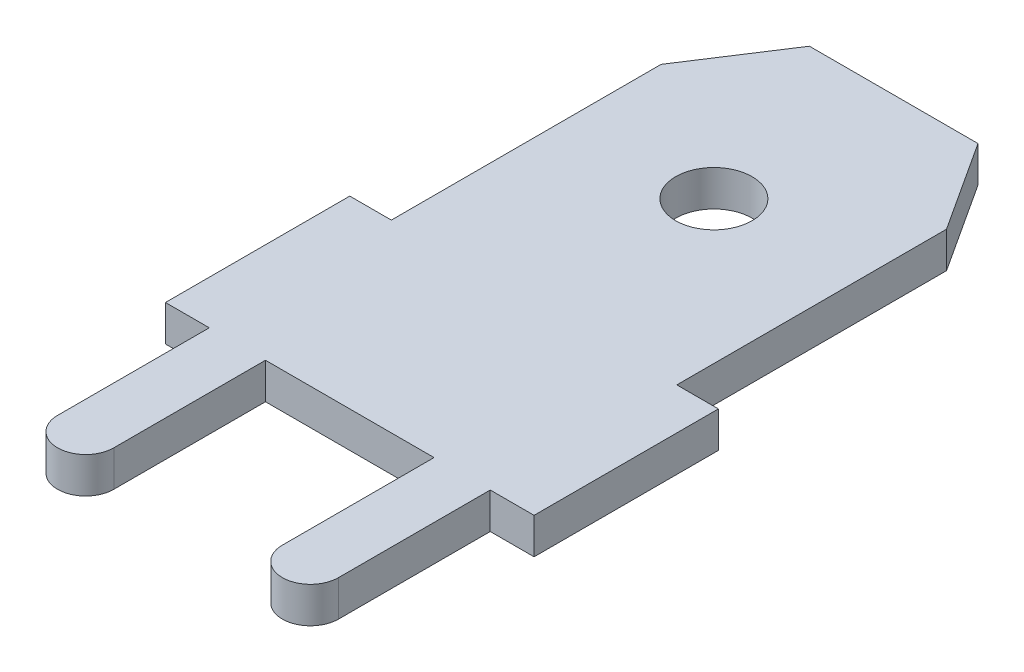
ISO-10303-21;
HEADER;
FILE_DESCRIPTION(('STEP AP214'),'2;1');
FILE_NAME('part.step','',(''),(''),'','','');
FILE_SCHEMA(('AUTOMOTIVE_DESIGN { 1 0 10303 214 1 1 1 1 }'));
ENDSEC;
DATA;
#1=APPLICATION_CONTEXT('core data for automotive mechanical design processes');
#2=APPLICATION_PROTOCOL_DEFINITION('international standard','automotive_design',2000,#1);
#3=PRODUCT_CONTEXT('',#1,'mechanical');
#4=PRODUCT('Part','Part','',(#3));
#5=PRODUCT_RELATED_PRODUCT_CATEGORY('part','',(#4));
#6=PRODUCT_DEFINITION_FORMATION('','',#4);
#7=PRODUCT_DEFINITION_CONTEXT('part definition',#1,'design');
#8=PRODUCT_DEFINITION('design','',#6,#7);
#9=PRODUCT_DEFINITION_SHAPE('','',#8);
#10=(LENGTH_UNIT() NAMED_UNIT(*) SI_UNIT(.MILLI.,.METRE.));
#11=(NAMED_UNIT(*) PLANE_ANGLE_UNIT() SI_UNIT($,.RADIAN.));
#12=(NAMED_UNIT(*) SI_UNIT($,.STERADIAN.) SOLID_ANGLE_UNIT());
#13=UNCERTAINTY_MEASURE_WITH_UNIT(LENGTH_MEASURE(1.E-05),#10,'distance_accuracy_value','');
#14=(GEOMETRIC_REPRESENTATION_CONTEXT(3) GLOBAL_UNCERTAINTY_ASSIGNED_CONTEXT((#13)) GLOBAL_UNIT_ASSIGNED_CONTEXT((#10,
#11,#12)) REPRESENTATION_CONTEXT('',''));
#15=CARTESIAN_POINT('',(0.,0.,0.));
#16=DIRECTION('',(0.,0.,1.));
#17=DIRECTION('',(1.,0.,0.));
#18=AXIS2_PLACEMENT_3D('',#15,#16,#17);
#19=CARTESIAN_POINT('',(2.5,0.4,7.475));
#20=DIRECTION('',(0.,-1.,0.));
#21=DIRECTION('',(0.,0.,-1.));
#22=AXIS2_PLACEMENT_3D('',#19,#20,#21);
#23=PLANE('',#22);
#24=DIRECTION('',(-0.544988350595413,0.,0.838443616300638));
#25=VECTOR('',#24,1.);
#26=CARTESIAN_POINT('',(-3.175,0.4,-6.));
#27=LINE('',#26,#25);
#28=CARTESIAN_POINT('',(-1.875,0.4,-8.));
#29=VERTEX_POINT('',#28);
#30=CARTESIAN_POINT('',(-3.175,0.4,-6.));
#31=VERTEX_POINT('',#30);
#32=EDGE_CURVE('E225',#29,#31,#27,.T.);
#33=ORIENTED_EDGE('',*,*,#32,.T.);
#34=DIRECTION('',(0.,0.,1.));
#35=VECTOR('',#34,1.);
#36=CARTESIAN_POINT('',(-3.175,0.4,-6.));
#37=LINE('',#36,#35);
#38=CARTESIAN_POINT('',(-3.175,0.4,0.));
#39=VERTEX_POINT('',#38);
#40=EDGE_CURVE('E123',#31,#39,#37,.T.);
#41=ORIENTED_EDGE('',*,*,#40,.T.);
#42=DIRECTION('',(-1.,0.,0.));
#43=VECTOR('',#42,1.);
#44=CARTESIAN_POINT('',(-3.175,0.4,0.));
#45=LINE('',#44,#43);
#46=CARTESIAN_POINT('',(-4.1,0.4,0.));
#47=VERTEX_POINT('',#46);
#48=EDGE_CURVE('E270',#39,#47,#45,.T.);
#49=ORIENTED_EDGE('',*,*,#48,.T.);
#50=DIRECTION('',(0.,0.,1.));
#51=VECTOR('',#50,1.);
#52=CARTESIAN_POINT('',(-4.1,0.4,0.));
#53=LINE('',#52,#51);
#54=CARTESIAN_POINT('',(-4.1,0.4,4.1));
#55=VERTEX_POINT('',#54);
#56=EDGE_CURVE('E289',#47,#55,#53,.T.);
#57=ORIENTED_EDGE('',*,*,#56,.T.);
#58=DIRECTION('',(1.,0.,0.));
#59=VECTOR('',#58,1.);
#60=CARTESIAN_POINT('',(-4.1,0.4,4.1));
#61=LINE('',#60,#59);
#62=CARTESIAN_POINT('',(-3.125,0.4,4.1));
#63=VERTEX_POINT('',#62);
#64=EDGE_CURVE('E286',#55,#63,#61,.T.);
#65=ORIENTED_EDGE('',*,*,#64,.T.);
#66=DIRECTION('',(0.,0.,1.));
#67=VECTOR('',#66,1.);
#68=CARTESIAN_POINT('',(-3.125,0.4,4.1));
#69=LINE('',#68,#67);
#70=CARTESIAN_POINT('',(-3.125,0.4,7.475));
#71=VERTEX_POINT('',#70);
#72=EDGE_CURVE('E288',#63,#71,#69,.T.);
#73=ORIENTED_EDGE('',*,*,#72,.T.);
#74=CARTESIAN_POINT('',(-2.5,0.4,7.475));
#75=DIRECTION('',(0.,1.,0.));
#76=DIRECTION('',(0.,0.,1.));
#77=AXIS2_PLACEMENT_3D('',#74,#75,#76);
#78=CIRCLE('',#77,0.625000000000001);
#79=CARTESIAN_POINT('',(-1.875,0.4,7.475));
#80=VERTEX_POINT('',#79);
#81=EDGE_CURVE('E291',#71,#80,#78,.T.);
#82=ORIENTED_EDGE('',*,*,#81,.T.);
#83=DIRECTION('',(0.,0.,-1.));
#84=VECTOR('',#83,1.);
#85=CARTESIAN_POINT('',(-1.875,0.4,4.1));
#86=LINE('',#85,#84);
#87=CARTESIAN_POINT('',(-1.875,0.4,4.1));
#88=VERTEX_POINT('',#87);
#89=EDGE_CURVE('E297',#80,#88,#86,.T.);
#90=ORIENTED_EDGE('',*,*,#89,.T.);
#91=DIRECTION('',(1.,0.,0.));
#92=VECTOR('',#91,1.);
#93=CARTESIAN_POINT('',(-1.875,0.4,4.1));
#94=LINE('',#93,#92);
#95=CARTESIAN_POINT('',(1.875,0.4,4.1));
#96=VERTEX_POINT('',#95);
#97=EDGE_CURVE('E299',#88,#96,#94,.T.);
#98=ORIENTED_EDGE('',*,*,#97,.T.);
#99=DIRECTION('',(0.,0.,1.));
#100=VECTOR('',#99,1.);
#101=CARTESIAN_POINT('',(1.875,0.4,4.1));
#102=LINE('',#101,#100);
#103=CARTESIAN_POINT('',(1.875,0.4,7.475));
#104=VERTEX_POINT('',#103);
#105=EDGE_CURVE('E301',#96,#104,#102,.T.);
#106=ORIENTED_EDGE('',*,*,#105,.T.);
#107=CARTESIAN_POINT('',(2.5,0.4,7.475));
#108=DIRECTION('',(0.,1.,0.));
#109=DIRECTION('',(0.,0.,-1.));
#110=AXIS2_PLACEMENT_3D('',#107,#108,#109);
#111=CIRCLE('',#110,0.625000000000001);
#112=CARTESIAN_POINT('',(3.125,0.4,7.475));
#113=VERTEX_POINT('',#112);
#114=EDGE_CURVE('E303',#104,#113,#111,.T.);
#115=ORIENTED_EDGE('',*,*,#114,.T.);
#116=DIRECTION('',(0.,0.,-1.));
#117=VECTOR('',#116,1.);
#118=CARTESIAN_POINT('',(3.125,0.4,4.1));
#119=LINE('',#118,#117);
#120=CARTESIAN_POINT('',(3.125,0.4,4.1));
#121=VERTEX_POINT('',#120);
#122=EDGE_CURVE('E305',#113,#121,#119,.T.);
#123=ORIENTED_EDGE('',*,*,#122,.T.);
#124=DIRECTION('',(1.,0.,0.));
#125=VECTOR('',#124,1.);
#126=CARTESIAN_POINT('',(4.1,0.4,4.1));
#127=LINE('',#126,#125);
#128=CARTESIAN_POINT('',(4.1,0.4,4.1));
#129=VERTEX_POINT('',#128);
#130=EDGE_CURVE('E307',#121,#129,#127,.T.);
#131=ORIENTED_EDGE('',*,*,#130,.T.);
#132=DIRECTION('',(0.,0.,-1.));
#133=VECTOR('',#132,1.);
#134=CARTESIAN_POINT('',(4.1,0.4,0.));
#135=LINE('',#134,#133);
#136=CARTESIAN_POINT('',(4.1,0.4,0.));
#137=VERTEX_POINT('',#136);
#138=EDGE_CURVE('E309',#129,#137,#135,.T.);
#139=ORIENTED_EDGE('',*,*,#138,.T.);
#140=DIRECTION('',(-1.,0.,0.));
#141=VECTOR('',#140,1.);
#142=CARTESIAN_POINT('',(3.175,0.4,0.));
#143=LINE('',#142,#141);
#144=CARTESIAN_POINT('',(3.175,0.4,0.));
#145=VERTEX_POINT('',#144);
#146=EDGE_CURVE('E172',#137,#145,#143,.T.);
#147=ORIENTED_EDGE('',*,*,#146,.T.);
#148=DIRECTION('',(0.,0.,-1.));
#149=VECTOR('',#148,1.);
#150=CARTESIAN_POINT('',(3.175,0.4,-6.));
#151=LINE('',#150,#149);
#152=CARTESIAN_POINT('',(3.175,0.4,-6.));
#153=VERTEX_POINT('',#152);
#154=EDGE_CURVE('E166',#145,#153,#151,.T.);
#155=ORIENTED_EDGE('',*,*,#154,.T.);
#156=DIRECTION('',(-0.544988350595413,0.,-0.838443616300638));
#157=VECTOR('',#156,1.);
#158=CARTESIAN_POINT('',(3.175,0.4,-6.));
#159=LINE('',#158,#157);
#160=CARTESIAN_POINT('',(1.875,0.4,-8.));
#161=VERTEX_POINT('',#160);
#162=EDGE_CURVE('E170',#153,#161,#159,.T.);
#163=ORIENTED_EDGE('',*,*,#162,.T.);
#164=DIRECTION('',(-1.,0.,0.));
#165=VECTOR('',#164,1.);
#166=CARTESIAN_POINT('',(-1.875,0.4,-8.));
#167=LINE('',#166,#165);
#168=EDGE_CURVE('E50',#161,#29,#167,.T.);
#169=ORIENTED_EDGE('',*,*,#168,.T.);
#170=EDGE_LOOP('',(#33,#41,#49,#57,#65,#73,#82,#90,#98,#106,#115,#123,#131,#139,#147,#155,#163,#169));
#171=FACE_BOUND('',#170,.T.);
#172=CARTESIAN_POINT('',(0.,0.4,-4.));
#173=DIRECTION('',(0.,1.,0.));
#174=DIRECTION('',(0.,0.,1.));
#175=AXIS2_PLACEMENT_3D('',#172,#173,#174);
#176=CIRCLE('',#175,0.85);
#177=CARTESIAN_POINT('',(0.,0.4,-3.15));
#178=VERTEX_POINT('',#177);
#179=EDGE_CURVE('E194',#178,#178,#176,.T.);
#180=ORIENTED_EDGE('',*,*,#179,.F.);
#181=EDGE_LOOP('',(#180));
#182=FACE_BOUND('',#181,.T.);
#183=ADVANCED_FACE('F33',(#171,#182),#23,.F.);
#184=CARTESIAN_POINT('',(2.5,-0.4,7.475));
#185=DIRECTION('',(0.,-1.,0.));
#186=DIRECTION('',(0.,0.,-1.));
#187=AXIS2_PLACEMENT_3D('',#184,#185,#186);
#188=PLANE('',#187);
#189=DIRECTION('',(-0.544988350595413,0.,0.838443616300638));
#190=VECTOR('',#189,1.);
#191=CARTESIAN_POINT('',(-3.175,-0.4,-6.));
#192=LINE('',#191,#190);
#193=CARTESIAN_POINT('',(-1.875,-0.4,-8.));
#194=VERTEX_POINT('',#193);
#195=CARTESIAN_POINT('',(-3.175,-0.4,-6.));
#196=VERTEX_POINT('',#195);
#197=EDGE_CURVE('E190',#194,#196,#192,.T.);
#198=ORIENTED_EDGE('',*,*,#197,.F.);
#199=DIRECTION('',(-1.,0.,0.));
#200=VECTOR('',#199,1.);
#201=CARTESIAN_POINT('',(-1.875,-0.4,-8.));
#202=LINE('',#201,#200);
#203=CARTESIAN_POINT('',(1.875,-0.4,-8.));
#204=VERTEX_POINT('',#203);
#205=EDGE_CURVE('E115',#204,#194,#202,.T.);
#206=ORIENTED_EDGE('',*,*,#205,.F.);
#207=DIRECTION('',(-0.544988350595413,0.,-0.838443616300638));
#208=VECTOR('',#207,1.);
#209=CARTESIAN_POINT('',(3.175,-0.4,-6.));
#210=LINE('',#209,#208);
#211=CARTESIAN_POINT('',(3.175,-0.4,-6.));
#212=VERTEX_POINT('',#211);
#213=EDGE_CURVE('E109',#212,#204,#210,.T.);
#214=ORIENTED_EDGE('',*,*,#213,.F.);
#215=DIRECTION('',(0.,0.,-1.));
#216=VECTOR('',#215,1.);
#217=CARTESIAN_POINT('',(3.175,-0.4,-6.));
#218=LINE('',#217,#216);
#219=CARTESIAN_POINT('',(3.175,-0.4,0.));
#220=VERTEX_POINT('',#219);
#221=EDGE_CURVE('E180',#220,#212,#218,.T.);
#222=ORIENTED_EDGE('',*,*,#221,.F.);
#223=DIRECTION('',(-1.,0.,0.));
#224=VECTOR('',#223,1.);
#225=CARTESIAN_POINT('',(3.175,-0.4,0.));
#226=LINE('',#225,#224);
#227=CARTESIAN_POINT('',(4.1,-0.4,0.));
#228=VERTEX_POINT('',#227);
#229=EDGE_CURVE('E220',#228,#220,#226,.T.);
#230=ORIENTED_EDGE('',*,*,#229,.F.);
#231=DIRECTION('',(0.,0.,-1.));
#232=VECTOR('',#231,1.);
#233=CARTESIAN_POINT('',(4.1,-0.4,0.));
#234=LINE('',#233,#232);
#235=CARTESIAN_POINT('',(4.1,-0.4,4.1));
#236=VERTEX_POINT('',#235);
#237=EDGE_CURVE('E218',#236,#228,#234,.T.);
#238=ORIENTED_EDGE('',*,*,#237,.F.);
#239=DIRECTION('',(1.,0.,0.));
#240=VECTOR('',#239,1.);
#241=CARTESIAN_POINT('',(4.1,-0.4,4.1));
#242=LINE('',#241,#240);
#243=CARTESIAN_POINT('',(3.125,-0.4,4.1));
#244=VERTEX_POINT('',#243);
#245=EDGE_CURVE('E216',#244,#236,#242,.T.);
#246=ORIENTED_EDGE('',*,*,#245,.F.);
#247=DIRECTION('',(0.,0.,-1.));
#248=VECTOR('',#247,1.);
#249=CARTESIAN_POINT('',(3.125,-0.4,4.1));
#250=LINE('',#249,#248);
#251=CARTESIAN_POINT('',(3.125,-0.4,7.475));
#252=VERTEX_POINT('',#251);
#253=EDGE_CURVE('E214',#252,#244,#250,.T.);
#254=ORIENTED_EDGE('',*,*,#253,.F.);
#255=CARTESIAN_POINT('',(2.5,-0.4,7.475));
#256=DIRECTION('',(0.,1.,0.));
#257=DIRECTION('',(0.,0.,-1.));
#258=AXIS2_PLACEMENT_3D('',#255,#256,#257);
#259=CIRCLE('',#258,0.625000000000001);
#260=CARTESIAN_POINT('',(1.875,-0.4,7.475));
#261=VERTEX_POINT('',#260);
#262=EDGE_CURVE('E212',#261,#252,#259,.T.);
#263=ORIENTED_EDGE('',*,*,#262,.F.);
#264=DIRECTION('',(0.,0.,1.));
#265=VECTOR('',#264,1.);
#266=CARTESIAN_POINT('',(1.875,-0.4,4.1));
#267=LINE('',#266,#265);
#268=CARTESIAN_POINT('',(1.875,-0.4,4.1));
#269=VERTEX_POINT('',#268);
#270=EDGE_CURVE('E210',#269,#261,#267,.T.);
#271=ORIENTED_EDGE('',*,*,#270,.F.);
#272=DIRECTION('',(1.,0.,0.));
#273=VECTOR('',#272,1.);
#274=CARTESIAN_POINT('',(-1.875,-0.4,4.1));
#275=LINE('',#274,#273);
#276=CARTESIAN_POINT('',(-1.875,-0.4,4.1));
#277=VERTEX_POINT('',#276);
#278=EDGE_CURVE('E208',#277,#269,#275,.T.);
#279=ORIENTED_EDGE('',*,*,#278,.F.);
#280=DIRECTION('',(0.,0.,-1.));
#281=VECTOR('',#280,1.);
#282=CARTESIAN_POINT('',(-1.875,-0.4,4.1));
#283=LINE('',#282,#281);
#284=CARTESIAN_POINT('',(-1.875,-0.4,7.475));
#285=VERTEX_POINT('',#284);
#286=EDGE_CURVE('E206',#285,#277,#283,.T.);
#287=ORIENTED_EDGE('',*,*,#286,.F.);
#288=CARTESIAN_POINT('',(-2.5,-0.4,7.475));
#289=DIRECTION('',(0.,1.,0.));
#290=DIRECTION('',(0.,0.,1.));
#291=AXIS2_PLACEMENT_3D('',#288,#289,#290);
#292=CIRCLE('',#291,0.625000000000001);
#293=CARTESIAN_POINT('',(-3.125,-0.4,7.475));
#294=VERTEX_POINT('',#293);
#295=EDGE_CURVE('E204',#294,#285,#292,.T.);
#296=ORIENTED_EDGE('',*,*,#295,.F.);
#297=DIRECTION('',(0.,0.,1.));
#298=VECTOR('',#297,1.);
#299=CARTESIAN_POINT('',(-3.125,-0.4,4.1));
#300=LINE('',#299,#298);
#301=CARTESIAN_POINT('',(-3.125,-0.4,4.1));
#302=VERTEX_POINT('',#301);
#303=EDGE_CURVE('E202',#302,#294,#300,.T.);
#304=ORIENTED_EDGE('',*,*,#303,.F.);
#305=DIRECTION('',(1.,0.,0.));
#306=VECTOR('',#305,1.);
#307=CARTESIAN_POINT('',(-4.1,-0.4,4.1));
#308=LINE('',#307,#306);
#309=CARTESIAN_POINT('',(-4.1,-0.4,4.1));
#310=VERTEX_POINT('',#309);
#311=EDGE_CURVE('E200',#310,#302,#308,.T.);
#312=ORIENTED_EDGE('',*,*,#311,.F.);
#313=DIRECTION('',(0.,0.,1.));
#314=VECTOR('',#313,1.);
#315=CARTESIAN_POINT('',(-4.1,-0.4,0.));
#316=LINE('',#315,#314);
#317=CARTESIAN_POINT('',(-4.1,-0.4,0.));
#318=VERTEX_POINT('',#317);
#319=EDGE_CURVE('E198',#318,#310,#316,.T.);
#320=ORIENTED_EDGE('',*,*,#319,.F.);
#321=DIRECTION('',(-1.,0.,0.));
#322=VECTOR('',#321,1.);
#323=CARTESIAN_POINT('',(-3.175,-0.4,0.));
#324=LINE('',#323,#322);
#325=CARTESIAN_POINT('',(-3.175,-0.4,0.));
#326=VERTEX_POINT('',#325);
#327=EDGE_CURVE('E196',#326,#318,#324,.T.);
#328=ORIENTED_EDGE('',*,*,#327,.F.);
#329=DIRECTION('',(0.,0.,1.));
#330=VECTOR('',#329,1.);
#331=CARTESIAN_POINT('',(-3.175,-0.4,-6.));
#332=LINE('',#331,#330);
#333=EDGE_CURVE('E193',#196,#326,#332,.T.);
#334=ORIENTED_EDGE('',*,*,#333,.F.);
#335=EDGE_LOOP('',(#198,#206,#214,#222,#230,#238,#246,#254,#263,#271,#279,#287,#296,#304,#312,
#320,#328,#334));
#336=FACE_BOUND('',#335,.T.);
#337=CARTESIAN_POINT('',(0.,-0.4,-4.));
#338=DIRECTION('',(0.,1.,0.));
#339=DIRECTION('',(0.,0.,1.));
#340=AXIS2_PLACEMENT_3D('',#337,#338,#339);
#341=CIRCLE('',#340,0.85);
#342=CARTESIAN_POINT('',(0.,-0.4,-3.15));
#343=VERTEX_POINT('',#342);
#344=EDGE_CURVE('E534',#343,#343,#341,.T.);
#345=ORIENTED_EDGE('',*,*,#344,.T.);
#346=EDGE_LOOP('',(#345));
#347=FACE_BOUND('',#346,.T.);
#348=ADVANCED_FACE('F274',(#336,#347),#188,.T.);
#349=CARTESIAN_POINT('',(-3.175,0.4,-6.));
#350=DIRECTION('',(0.838443616300638,0.,0.544988350595413));
#351=DIRECTION('',(0.544988350595413,0.,-0.838443616300638));
#352=AXIS2_PLACEMENT_3D('',#349,#350,#351);
#353=PLANE('',#352);
#354=ORIENTED_EDGE('',*,*,#197,.T.);
#355=DIRECTION('',(0.,-1.,0.));
#356=VECTOR('',#355,1.);
#357=CARTESIAN_POINT('',(-3.175,0.4,-6.));
#358=LINE('',#357,#356);
#359=EDGE_CURVE('E11',#31,#196,#358,.T.);
#360=ORIENTED_EDGE('',*,*,#359,.F.);
#361=ORIENTED_EDGE('',*,*,#32,.F.);
#362=DIRECTION('',(0.,-1.,0.));
#363=VECTOR('',#362,1.);
#364=CARTESIAN_POINT('',(-1.875,0.4,-8.));
#365=LINE('',#364,#363);
#366=EDGE_CURVE('E186',#29,#194,#365,.T.);
#367=ORIENTED_EDGE('',*,*,#366,.T.);
#368=EDGE_LOOP('',(#354,#360,#361,#367));
#369=FACE_BOUND('',#368,.T.);
#370=ADVANCED_FACE('F35',(#369),#353,.F.);
#371=CARTESIAN_POINT('',(-3.175,0.4,-6.));
#372=DIRECTION('',(1.,0.,0.));
#373=DIRECTION('',(0.,0.,-1.));
#374=AXIS2_PLACEMENT_3D('',#371,#372,#373);
#375=PLANE('',#374);
#376=ORIENTED_EDGE('',*,*,#333,.T.);
#377=DIRECTION('',(0.,-1.,0.));
#378=VECTOR('',#377,1.);
#379=CARTESIAN_POINT('',(-3.175,0.4,0.));
#380=LINE('',#379,#378);
#381=EDGE_CURVE('E42',#39,#326,#380,.T.);
#382=ORIENTED_EDGE('',*,*,#381,.F.);
#383=ORIENTED_EDGE('',*,*,#40,.F.);
#384=ORIENTED_EDGE('',*,*,#359,.T.);
#385=EDGE_LOOP('',(#376,#382,#383,#384));
#386=FACE_BOUND('',#385,.T.);
#387=ADVANCED_FACE('F343',(#386),#375,.F.);
#388=CARTESIAN_POINT('',(-3.175,0.4,0.));
#389=DIRECTION('',(0.,0.,1.));
#390=DIRECTION('',(1.,0.,0.));
#391=AXIS2_PLACEMENT_3D('',#388,#389,#390);
#392=PLANE('',#391);
#393=ORIENTED_EDGE('',*,*,#327,.T.);
#394=DIRECTION('',(0.,-1.,0.));
#395=VECTOR('',#394,1.);
#396=CARTESIAN_POINT('',(-4.1,0.4,0.));
#397=LINE('',#396,#395);
#398=EDGE_CURVE('E262',#47,#318,#397,.T.);
#399=ORIENTED_EDGE('',*,*,#398,.F.);
#400=ORIENTED_EDGE('',*,*,#48,.F.);
#401=ORIENTED_EDGE('',*,*,#381,.T.);
#402=EDGE_LOOP('',(#393,#399,#400,#401));
#403=FACE_BOUND('',#402,.T.);
#404=ADVANCED_FACE('F268',(#403),#392,.F.);
#405=CARTESIAN_POINT('',(-4.1,0.4,0.));
#406=DIRECTION('',(1.,0.,0.));
#407=DIRECTION('',(0.,0.,-1.));
#408=AXIS2_PLACEMENT_3D('',#405,#406,#407);
#409=PLANE('',#408);
#410=ORIENTED_EDGE('',*,*,#319,.T.);
#411=DIRECTION('',(0.,-1.,0.));
#412=VECTOR('',#411,1.);
#413=CARTESIAN_POINT('',(-4.1,0.4,4.1));
#414=LINE('',#413,#412);
#415=EDGE_CURVE('E259',#55,#310,#414,.T.);
#416=ORIENTED_EDGE('',*,*,#415,.F.);
#417=ORIENTED_EDGE('',*,*,#56,.F.);
#418=ORIENTED_EDGE('',*,*,#398,.T.);
#419=EDGE_LOOP('',(#410,#416,#417,#418));
#420=FACE_BOUND('',#419,.T.);
#421=ADVANCED_FACE('F280',(#420),#409,.F.);
#422=CARTESIAN_POINT('',(-4.1,0.4,4.1));
#423=DIRECTION('',(0.,0.,-1.));
#424=DIRECTION('',(-1.,0.,0.));
#425=AXIS2_PLACEMENT_3D('',#422,#423,#424);
#426=PLANE('',#425);
#427=ORIENTED_EDGE('',*,*,#311,.T.);
#428=DIRECTION('',(0.,-1.,0.));
#429=VECTOR('',#428,1.);
#430=CARTESIAN_POINT('',(-3.125,0.4,4.1));
#431=LINE('',#430,#429);
#432=EDGE_CURVE('E256',#63,#302,#431,.T.);
#433=ORIENTED_EDGE('',*,*,#432,.F.);
#434=ORIENTED_EDGE('',*,*,#64,.F.);
#435=ORIENTED_EDGE('',*,*,#415,.T.);
#436=EDGE_LOOP('',(#427,#433,#434,#435));
#437=FACE_BOUND('',#436,.T.);
#438=ADVANCED_FACE('F284',(#437),#426,.F.);
#439=CARTESIAN_POINT('',(-3.125,0.4,4.1));
#440=DIRECTION('',(1.,0.,0.));
#441=DIRECTION('',(0.,0.,-1.));
#442=AXIS2_PLACEMENT_3D('',#439,#440,#441);
#443=PLANE('',#442);
#444=ORIENTED_EDGE('',*,*,#303,.T.);
#445=DIRECTION('',(0.,-1.,0.));
#446=VECTOR('',#445,1.);
#447=CARTESIAN_POINT('',(-3.125,0.4,7.475));
#448=LINE('',#447,#446);
#449=EDGE_CURVE('E253',#71,#294,#448,.T.);
#450=ORIENTED_EDGE('',*,*,#449,.F.);
#451=ORIENTED_EDGE('',*,*,#72,.F.);
#452=ORIENTED_EDGE('',*,*,#432,.T.);
#453=EDGE_LOOP('',(#444,#450,#451,#452));
#454=FACE_BOUND('',#453,.T.);
#455=ADVANCED_FACE('F356',(#454),#443,.F.);
#456=CARTESIAN_POINT('',(-2.5,0.4,7.475));
#457=DIRECTION('',(0.,-1.,0.));
#458=DIRECTION('',(0.,0.,-1.));
#459=AXIS2_PLACEMENT_3D('',#456,#457,#458);
#460=CYLINDRICAL_SURFACE('',#459,0.625000000000001);
#461=ORIENTED_EDGE('',*,*,#295,.T.);
#462=DIRECTION('',(0.,-1.,0.));
#463=VECTOR('',#462,1.);
#464=CARTESIAN_POINT('',(-1.875,0.4,7.475));
#465=LINE('',#464,#463);
#466=EDGE_CURVE('E250',#80,#285,#465,.T.);
#467=ORIENTED_EDGE('',*,*,#466,.F.);
#468=ORIENTED_EDGE('',*,*,#81,.F.);
#469=ORIENTED_EDGE('',*,*,#449,.T.);
#470=EDGE_LOOP('',(#461,#467,#468,#469));
#471=FACE_BOUND('',#470,.T.);
#472=ADVANCED_FACE('F359',(#471),#460,.T.);
#473=CARTESIAN_POINT('',(-1.875,0.4,4.1));
#474=DIRECTION('',(-1.,0.,0.));
#475=DIRECTION('',(0.,0.,1.));
#476=AXIS2_PLACEMENT_3D('',#473,#474,#475);
#477=PLANE('',#476);
#478=ORIENTED_EDGE('',*,*,#286,.T.);
#479=DIRECTION('',(0.,-1.,0.));
#480=VECTOR('',#479,1.);
#481=CARTESIAN_POINT('',(-1.875,0.4,4.1));
#482=LINE('',#481,#480);
#483=EDGE_CURVE('E247',#88,#277,#482,.T.);
#484=ORIENTED_EDGE('',*,*,#483,.F.);
#485=ORIENTED_EDGE('',*,*,#89,.F.);
#486=ORIENTED_EDGE('',*,*,#466,.T.);
#487=EDGE_LOOP('',(#478,#484,#485,#486));
#488=FACE_BOUND('',#487,.T.);
#489=ADVANCED_FACE('F363',(#488),#477,.F.);
#490=CARTESIAN_POINT('',(-1.875,0.4,4.1));
#491=DIRECTION('',(0.,0.,-1.));
#492=DIRECTION('',(-1.,0.,0.));
#493=AXIS2_PLACEMENT_3D('',#490,#491,#492);
#494=PLANE('',#493);
#495=ORIENTED_EDGE('',*,*,#278,.T.);
#496=DIRECTION('',(0.,-1.,0.));
#497=VECTOR('',#496,1.);
#498=CARTESIAN_POINT('',(1.875,0.4,4.1));
#499=LINE('',#498,#497);
#500=EDGE_CURVE('E244',#96,#269,#499,.T.);
#501=ORIENTED_EDGE('',*,*,#500,.F.);
#502=ORIENTED_EDGE('',*,*,#97,.F.);
#503=ORIENTED_EDGE('',*,*,#483,.T.);
#504=EDGE_LOOP('',(#495,#501,#502,#503));
#505=FACE_BOUND('',#504,.T.);
#506=ADVANCED_FACE('F367',(#505),#494,.F.);
#507=CARTESIAN_POINT('',(1.875,0.4,4.1));
#508=DIRECTION('',(1.,0.,0.));
#509=DIRECTION('',(0.,0.,-1.));
#510=AXIS2_PLACEMENT_3D('',#507,#508,#509);
#511=PLANE('',#510);
#512=ORIENTED_EDGE('',*,*,#270,.T.);
#513=DIRECTION('',(0.,-1.,0.));
#514=VECTOR('',#513,1.);
#515=CARTESIAN_POINT('',(1.875,0.4,7.475));
#516=LINE('',#515,#514);
#517=EDGE_CURVE('E241',#104,#261,#516,.T.);
#518=ORIENTED_EDGE('',*,*,#517,.F.);
#519=ORIENTED_EDGE('',*,*,#105,.F.);
#520=ORIENTED_EDGE('',*,*,#500,.T.);
#521=EDGE_LOOP('',(#512,#518,#519,#520));
#522=FACE_BOUND('',#521,.T.);
#523=ADVANCED_FACE('F371',(#522),#511,.F.);
#524=CARTESIAN_POINT('',(2.5,0.4,7.475));
#525=DIRECTION('',(0.,-1.,0.));
#526=DIRECTION('',(0.,0.,-1.));
#527=AXIS2_PLACEMENT_3D('',#524,#525,#526);
#528=CYLINDRICAL_SURFACE('',#527,0.625000000000001);
#529=ORIENTED_EDGE('',*,*,#262,.T.);
#530=DIRECTION('',(0.,-1.,0.));
#531=VECTOR('',#530,1.);
#532=CARTESIAN_POINT('',(3.125,0.4,7.475));
#533=LINE('',#532,#531);
#534=EDGE_CURVE('E238',#113,#252,#533,.T.);
#535=ORIENTED_EDGE('',*,*,#534,.F.);
#536=ORIENTED_EDGE('',*,*,#114,.F.);
#537=ORIENTED_EDGE('',*,*,#517,.T.);
#538=EDGE_LOOP('',(#529,#535,#536,#537));
#539=FACE_BOUND('',#538,.T.);
#540=ADVANCED_FACE('F375',(#539),#528,.T.);
#541=CARTESIAN_POINT('',(3.125,0.4,4.1));
#542=DIRECTION('',(-1.,0.,0.));
#543=DIRECTION('',(0.,0.,1.));
#544=AXIS2_PLACEMENT_3D('',#541,#542,#543);
#545=PLANE('',#544);
#546=ORIENTED_EDGE('',*,*,#253,.T.);
#547=DIRECTION('',(0.,-1.,0.));
#548=VECTOR('',#547,1.);
#549=CARTESIAN_POINT('',(3.125,0.4,4.1));
#550=LINE('',#549,#548);
#551=EDGE_CURVE('E235',#121,#244,#550,.T.);
#552=ORIENTED_EDGE('',*,*,#551,.F.);
#553=ORIENTED_EDGE('',*,*,#122,.F.);
#554=ORIENTED_EDGE('',*,*,#534,.T.);
#555=EDGE_LOOP('',(#546,#552,#553,#554));
#556=FACE_BOUND('',#555,.T.);
#557=ADVANCED_FACE('F379',(#556),#545,.F.);
#558=CARTESIAN_POINT('',(4.1,0.4,4.1));
#559=DIRECTION('',(0.,0.,-1.));
#560=DIRECTION('',(-1.,0.,0.));
#561=AXIS2_PLACEMENT_3D('',#558,#559,#560);
#562=PLANE('',#561);
#563=ORIENTED_EDGE('',*,*,#245,.T.);
#564=DIRECTION('',(0.,-1.,0.));
#565=VECTOR('',#564,1.);
#566=CARTESIAN_POINT('',(4.1,0.4,4.1));
#567=LINE('',#566,#565);
#568=EDGE_CURVE('E232',#129,#236,#567,.T.);
#569=ORIENTED_EDGE('',*,*,#568,.F.);
#570=ORIENTED_EDGE('',*,*,#130,.F.);
#571=ORIENTED_EDGE('',*,*,#551,.T.);
#572=EDGE_LOOP('',(#563,#569,#570,#571));
#573=FACE_BOUND('',#572,.T.);
#574=ADVANCED_FACE('F383',(#573),#562,.F.);
#575=CARTESIAN_POINT('',(4.1,0.4,0.));
#576=DIRECTION('',(-1.,0.,0.));
#577=DIRECTION('',(0.,0.,1.));
#578=AXIS2_PLACEMENT_3D('',#575,#576,#577);
#579=PLANE('',#578);
#580=ORIENTED_EDGE('',*,*,#237,.T.);
#581=DIRECTION('',(0.,-1.,0.));
#582=VECTOR('',#581,1.);
#583=CARTESIAN_POINT('',(4.1,0.4,0.));
#584=LINE('',#583,#582);
#585=EDGE_CURVE('E229',#137,#228,#584,.T.);
#586=ORIENTED_EDGE('',*,*,#585,.F.);
#587=ORIENTED_EDGE('',*,*,#138,.F.);
#588=ORIENTED_EDGE('',*,*,#568,.T.);
#589=EDGE_LOOP('',(#580,#586,#587,#588));
#590=FACE_BOUND('',#589,.T.);
#591=ADVANCED_FACE('F315',(#590),#579,.F.);
#592=CARTESIAN_POINT('',(3.175,0.4,0.));
#593=DIRECTION('',(0.,0.,1.));
#594=DIRECTION('',(1.,0.,0.));
#595=AXIS2_PLACEMENT_3D('',#592,#593,#594);
#596=PLANE('',#595);
#597=ORIENTED_EDGE('',*,*,#229,.T.);
#598=DIRECTION('',(0.,-1.,0.));
#599=VECTOR('',#598,1.);
#600=CARTESIAN_POINT('',(3.175,0.4,0.));
#601=LINE('',#600,#599);
#602=EDGE_CURVE('E181',#145,#220,#601,.T.);
#603=ORIENTED_EDGE('',*,*,#602,.F.);
#604=ORIENTED_EDGE('',*,*,#146,.F.);
#605=ORIENTED_EDGE('',*,*,#585,.T.);
#606=EDGE_LOOP('',(#597,#603,#604,#605));
#607=FACE_BOUND('',#606,.T.);
#608=ADVANCED_FACE('F319',(#607),#596,.F.);
#609=CARTESIAN_POINT('',(3.175,0.4,-6.));
#610=DIRECTION('',(-1.,0.,0.));
#611=DIRECTION('',(0.,0.,1.));
#612=AXIS2_PLACEMENT_3D('',#609,#610,#611);
#613=PLANE('',#612);
#614=ORIENTED_EDGE('',*,*,#221,.T.);
#615=DIRECTION('',(0.,-1.,0.));
#616=VECTOR('',#615,1.);
#617=CARTESIAN_POINT('',(3.175,0.4,-6.));
#618=LINE('',#617,#616);
#619=EDGE_CURVE('E177',#153,#212,#618,.T.);
#620=ORIENTED_EDGE('',*,*,#619,.F.);
#621=ORIENTED_EDGE('',*,*,#154,.F.);
#622=ORIENTED_EDGE('',*,*,#602,.T.);
#623=EDGE_LOOP('',(#614,#620,#621,#622));
#624=FACE_BOUND('',#623,.T.);
#625=ADVANCED_FACE('F178',(#624),#613,.F.);
#626=CARTESIAN_POINT('',(3.175,0.4,-6.));
#627=DIRECTION('',(-0.838443616300638,0.,0.544988350595413));
#628=DIRECTION('',(0.544988350595413,0.,0.838443616300638));
#629=AXIS2_PLACEMENT_3D('',#626,#627,#628);
#630=PLANE('',#629);
#631=ORIENTED_EDGE('',*,*,#213,.T.);
#632=DIRECTION('',(0.,-1.,0.));
#633=VECTOR('',#632,1.);
#634=CARTESIAN_POINT('',(1.875,0.4,-8.));
#635=LINE('',#634,#633);
#636=EDGE_CURVE('E182',#161,#204,#635,.T.);
#637=ORIENTED_EDGE('',*,*,#636,.F.);
#638=ORIENTED_EDGE('',*,*,#162,.F.);
#639=ORIENTED_EDGE('',*,*,#619,.T.);
#640=EDGE_LOOP('',(#631,#637,#638,#639));
#641=FACE_BOUND('',#640,.T.);
#642=ADVANCED_FACE('F184',(#641),#630,.F.);
#643=CARTESIAN_POINT('',(-1.875,0.4,-8.));
#644=DIRECTION('',(0.,0.,1.));
#645=DIRECTION('',(1.,0.,0.));
#646=AXIS2_PLACEMENT_3D('',#643,#644,#645);
#647=PLANE('',#646);
#648=ORIENTED_EDGE('',*,*,#205,.T.);
#649=ORIENTED_EDGE('',*,*,#366,.F.);
#650=ORIENTED_EDGE('',*,*,#168,.F.);
#651=ORIENTED_EDGE('',*,*,#636,.T.);
#652=EDGE_LOOP('',(#648,#649,#650,#651));
#653=FACE_BOUND('',#652,.T.);
#654=ADVANCED_FACE('F323',(#653),#647,.F.);
#655=CARTESIAN_POINT('',(0.,0.4,-4.));
#656=DIRECTION('',(0.,-1.,0.));
#657=DIRECTION('',(0.,0.,-1.));
#658=AXIS2_PLACEMENT_3D('',#655,#656,#657);
#659=CYLINDRICAL_SURFACE('',#658,0.85);
#660=ORIENTED_EDGE('',*,*,#179,.T.);
#661=EDGE_LOOP('',(#660));
#662=FACE_BOUND('',#661,.T.);
#663=ORIENTED_EDGE('',*,*,#344,.F.);
#664=EDGE_LOOP('',(#663));
#665=FACE_BOUND('',#664,.T.);
#666=ADVANCED_FACE('F325',(#662,#665),#659,.F.);
#667=CLOSED_SHELL('',(#183,#348,#370,#387,#404,#421,#438,#455,#472,#489,#506,#523,#540,#557,
#574,#591,#608,#625,#642,#654,#666));
#668=MANIFOLD_SOLID_BREP('B2',#667);
#669=ADVANCED_BREP_SHAPE_REPRESENTATION('',(#18,#668),#14);
#670=SHAPE_DEFINITION_REPRESENTATION(#9,#669);
ENDSEC;
END-ISO-10303-21;
